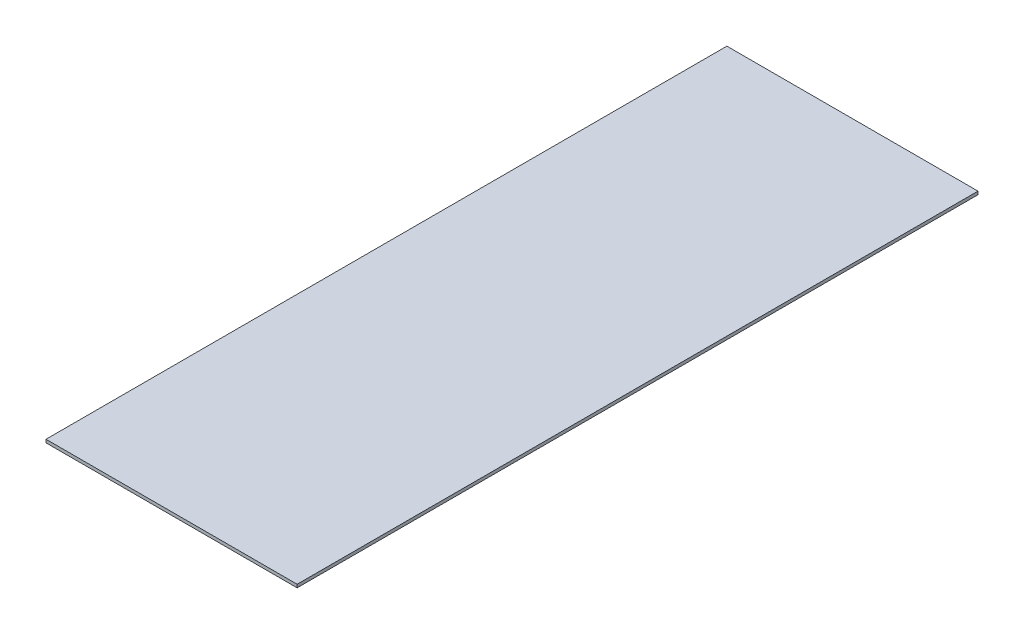
ISO-10303-21;
HEADER;
FILE_DESCRIPTION(('STEP AP214'),'2;1');
FILE_NAME('part.step','',(''),(''),'','','');
FILE_SCHEMA(('AUTOMOTIVE_DESIGN { 1 0 10303 214 1 1 1 1 }'));
ENDSEC;
DATA;
#1=APPLICATION_CONTEXT('core data for automotive mechanical design processes');
#2=APPLICATION_PROTOCOL_DEFINITION('international standard','automotive_design',2000,#1);
#3=PRODUCT_CONTEXT('',#1,'mechanical');
#4=PRODUCT('Part','Part','',(#3));
#5=PRODUCT_RELATED_PRODUCT_CATEGORY('part','',(#4));
#6=PRODUCT_DEFINITION_FORMATION('','',#4);
#7=PRODUCT_DEFINITION_CONTEXT('part definition',#1,'design');
#8=PRODUCT_DEFINITION('design','',#6,#7);
#9=PRODUCT_DEFINITION_SHAPE('','',#8);
#10=(LENGTH_UNIT() NAMED_UNIT(*) SI_UNIT(.MILLI.,.METRE.));
#11=(NAMED_UNIT(*) PLANE_ANGLE_UNIT() SI_UNIT($,.RADIAN.));
#12=(NAMED_UNIT(*) SI_UNIT($,.STERADIAN.) SOLID_ANGLE_UNIT());
#13=UNCERTAINTY_MEASURE_WITH_UNIT(LENGTH_MEASURE(1.E-05),#10,'distance_accuracy_value','');
#14=(GEOMETRIC_REPRESENTATION_CONTEXT(3) GLOBAL_UNCERTAINTY_ASSIGNED_CONTEXT((#13)) GLOBAL_UNIT_ASSIGNED_CONTEXT((#10,
#11,#12)) REPRESENTATION_CONTEXT('',''));
#15=CARTESIAN_POINT('',(0.,0.,0.));
#16=DIRECTION('',(0.,0.,1.));
#17=DIRECTION('',(1.,0.,0.));
#18=AXIS2_PLACEMENT_3D('',#15,#16,#17);
#19=CARTESIAN_POINT('',(-30.2999567298466,2.54,-36.3098655027088));
#20=DIRECTION('',(1.,0.,0.));
#21=DIRECTION('',(0.,0.,-1.));
#22=AXIS2_PLACEMENT_3D('',#19,#20,#21);
#23=PLANE('',#22);
#24=DIRECTION('',(0.,0.,1.));
#25=VECTOR('',#24,1.);
#26=CARTESIAN_POINT('',(-30.2999567298466,0.,-36.3098655027088));
#27=LINE('',#26,#25);
#28=CARTESIAN_POINT('',(-30.2999567298466,0.,-36.3098655027088));
#29=VERTEX_POINT('',#28);
#30=CARTESIAN_POINT('',(-30.2999567298465,0.,514.616134497291));
#31=VERTEX_POINT('',#30);
#32=EDGE_CURVE('E96',#29,#31,#27,.T.);
#33=ORIENTED_EDGE('',*,*,#32,.T.);
#34=DIRECTION('',(0.,-1.,0.));
#35=VECTOR('',#34,1.);
#36=CARTESIAN_POINT('',(-30.2999567298465,2.54,514.616134497291));
#37=LINE('',#36,#35);
#38=CARTESIAN_POINT('',(-30.2999567298465,2.54,514.616134497291));
#39=VERTEX_POINT('',#38);
#40=EDGE_CURVE('E11',#39,#31,#37,.T.);
#41=ORIENTED_EDGE('',*,*,#40,.F.);
#42=DIRECTION('',(0.,0.,1.));
#43=VECTOR('',#42,1.);
#44=CARTESIAN_POINT('',(-30.2999567298466,2.54,-36.3098655027088));
#45=LINE('',#44,#43);
#46=CARTESIAN_POINT('',(-30.2999567298466,2.54,-36.3098655027088));
#47=VERTEX_POINT('',#46);
#48=EDGE_CURVE('E84',#47,#39,#45,.T.);
#49=ORIENTED_EDGE('',*,*,#48,.F.);
#50=DIRECTION('',(0.,-1.,0.));
#51=VECTOR('',#50,1.);
#52=CARTESIAN_POINT('',(-30.2999567298466,2.54,-36.3098655027088));
#53=LINE('',#52,#51);
#54=EDGE_CURVE('E92',#47,#29,#53,.T.);
#55=ORIENTED_EDGE('',*,*,#54,.T.);
#56=EDGE_LOOP('',(#33,#41,#49,#55));
#57=FACE_BOUND('',#56,.T.);
#58=ADVANCED_FACE('F33',(#57),#23,.F.);
#59=CARTESIAN_POINT('',(-30.2999567298465,2.54,514.616134497291));
#60=DIRECTION('',(0.,0.,-1.));
#61=DIRECTION('',(-1.,0.,0.));
#62=AXIS2_PLACEMENT_3D('',#59,#60,#61);
#63=PLANE('',#62);
#64=DIRECTION('',(1.,0.,0.));
#65=VECTOR('',#64,1.);
#66=CARTESIAN_POINT('',(-30.2999567298465,0.,514.616134497291));
#67=LINE('',#66,#65);
#68=CARTESIAN_POINT('',(172.900043270153,0.,514.616134497291));
#69=VERTEX_POINT('',#68);
#70=EDGE_CURVE('E88',#31,#69,#67,.T.);
#71=ORIENTED_EDGE('',*,*,#70,.T.);
#72=DIRECTION('',(0.,-1.,0.));
#73=VECTOR('',#72,1.);
#74=CARTESIAN_POINT('',(172.900043270153,2.54,514.616134497291));
#75=LINE('',#74,#73);
#76=CARTESIAN_POINT('',(172.900043270153,2.54,514.616134497291));
#77=VERTEX_POINT('',#76);
#78=EDGE_CURVE('E41',#77,#69,#75,.T.);
#79=ORIENTED_EDGE('',*,*,#78,.F.);
#80=DIRECTION('',(1.,0.,0.));
#81=VECTOR('',#80,1.);
#82=CARTESIAN_POINT('',(-30.2999567298465,2.54,514.616134497291));
#83=LINE('',#82,#81);
#84=EDGE_CURVE('E79',#39,#77,#83,.T.);
#85=ORIENTED_EDGE('',*,*,#84,.F.);
#86=ORIENTED_EDGE('',*,*,#40,.T.);
#87=EDGE_LOOP('',(#71,#79,#85,#86));
#88=FACE_BOUND('',#87,.T.);
#89=ADVANCED_FACE('F87',(#88),#63,.F.);
#90=CARTESIAN_POINT('',(172.900043270153,2.54,-36.3098655027088));
#91=DIRECTION('',(-1.,0.,0.));
#92=DIRECTION('',(0.,0.,1.));
#93=AXIS2_PLACEMENT_3D('',#90,#91,#92);
#94=PLANE('',#93);
#95=DIRECTION('',(0.,0.,-1.));
#96=VECTOR('',#95,1.);
#97=CARTESIAN_POINT('',(172.900043270153,0.,-36.3098655027088));
#98=LINE('',#97,#96);
#99=CARTESIAN_POINT('',(172.900043270153,0.,-36.3098655027088));
#100=VERTEX_POINT('',#99);
#101=EDGE_CURVE('E66',#69,#100,#98,.T.);
#102=ORIENTED_EDGE('',*,*,#101,.T.);
#103=DIRECTION('',(0.,-1.,0.));
#104=VECTOR('',#103,1.);
#105=CARTESIAN_POINT('',(172.900043270153,2.54,-36.3098655027088));
#106=LINE('',#105,#104);
#107=CARTESIAN_POINT('',(172.900043270153,2.54,-36.3098655027088));
#108=VERTEX_POINT('',#107);
#109=EDGE_CURVE('E89',#108,#100,#106,.T.);
#110=ORIENTED_EDGE('',*,*,#109,.F.);
#111=DIRECTION('',(0.,0.,-1.));
#112=VECTOR('',#111,1.);
#113=CARTESIAN_POINT('',(172.900043270153,2.54,-36.3098655027088));
#114=LINE('',#113,#112);
#115=EDGE_CURVE('E82',#77,#108,#114,.T.);
#116=ORIENTED_EDGE('',*,*,#115,.F.);
#117=ORIENTED_EDGE('',*,*,#78,.T.);
#118=EDGE_LOOP('',(#102,#110,#116,#117));
#119=FACE_BOUND('',#118,.T.);
#120=ADVANCED_FACE('F90',(#119),#94,.F.);
#121=CARTESIAN_POINT('',(-30.2999567298466,2.54,-36.3098655027088));
#122=DIRECTION('',(0.,0.,1.));
#123=DIRECTION('',(1.,0.,0.));
#124=AXIS2_PLACEMENT_3D('',#121,#122,#123);
#125=PLANE('',#124);
#126=DIRECTION('',(-1.,0.,0.));
#127=VECTOR('',#126,1.);
#128=CARTESIAN_POINT('',(-30.2999567298466,0.,-36.3098655027088));
#129=LINE('',#128,#127);
#130=EDGE_CURVE('E72',#100,#29,#129,.T.);
#131=ORIENTED_EDGE('',*,*,#130,.T.);
#132=ORIENTED_EDGE('',*,*,#54,.F.);
#133=DIRECTION('',(-1.,0.,0.));
#134=VECTOR('',#133,1.);
#135=CARTESIAN_POINT('',(-30.2999567298466,2.54,-36.3098655027088));
#136=LINE('',#135,#134);
#137=EDGE_CURVE('E49',#108,#47,#136,.T.);
#138=ORIENTED_EDGE('',*,*,#137,.F.);
#139=ORIENTED_EDGE('',*,*,#109,.T.);
#140=EDGE_LOOP('',(#131,#132,#138,#139));
#141=FACE_BOUND('',#140,.T.);
#142=ADVANCED_FACE('F103',(#141),#125,.F.);
#143=CARTESIAN_POINT('',(0.,2.54,0.));
#144=DIRECTION('',(0.,1.,0.));
#145=DIRECTION('',(0.,0.,1.));
#146=AXIS2_PLACEMENT_3D('',#143,#144,#145);
#147=PLANE('',#146);
#148=ORIENTED_EDGE('',*,*,#48,.T.);
#149=ORIENTED_EDGE('',*,*,#84,.T.);
#150=ORIENTED_EDGE('',*,*,#115,.T.);
#151=ORIENTED_EDGE('',*,*,#137,.T.);
#152=EDGE_LOOP('',(#148,#149,#150,#151));
#153=FACE_BOUND('',#152,.T.);
#154=ADVANCED_FACE('F80',(#153),#147,.T.);
#155=CARTESIAN_POINT('',(0.,0.,0.));
#156=DIRECTION('',(0.,1.,0.));
#157=DIRECTION('',(0.,0.,1.));
#158=AXIS2_PLACEMENT_3D('',#155,#156,#157);
#159=PLANE('',#158);
#160=ORIENTED_EDGE('',*,*,#32,.F.);
#161=ORIENTED_EDGE('',*,*,#130,.F.);
#162=ORIENTED_EDGE('',*,*,#101,.F.);
#163=ORIENTED_EDGE('',*,*,#70,.F.);
#164=EDGE_LOOP('',(#160,#161,#162,#163));
#165=FACE_BOUND('',#164,.T.);
#166=ADVANCED_FACE('F106',(#165),#159,.F.);
#167=CLOSED_SHELL('',(#58,#89,#120,#142,#154,#166));
#168=MANIFOLD_SOLID_BREP('B2',#167);
#169=ADVANCED_BREP_SHAPE_REPRESENTATION('',(#18,#168),#14);
#170=SHAPE_DEFINITION_REPRESENTATION(#9,#169);
ENDSEC;
END-ISO-10303-21;
